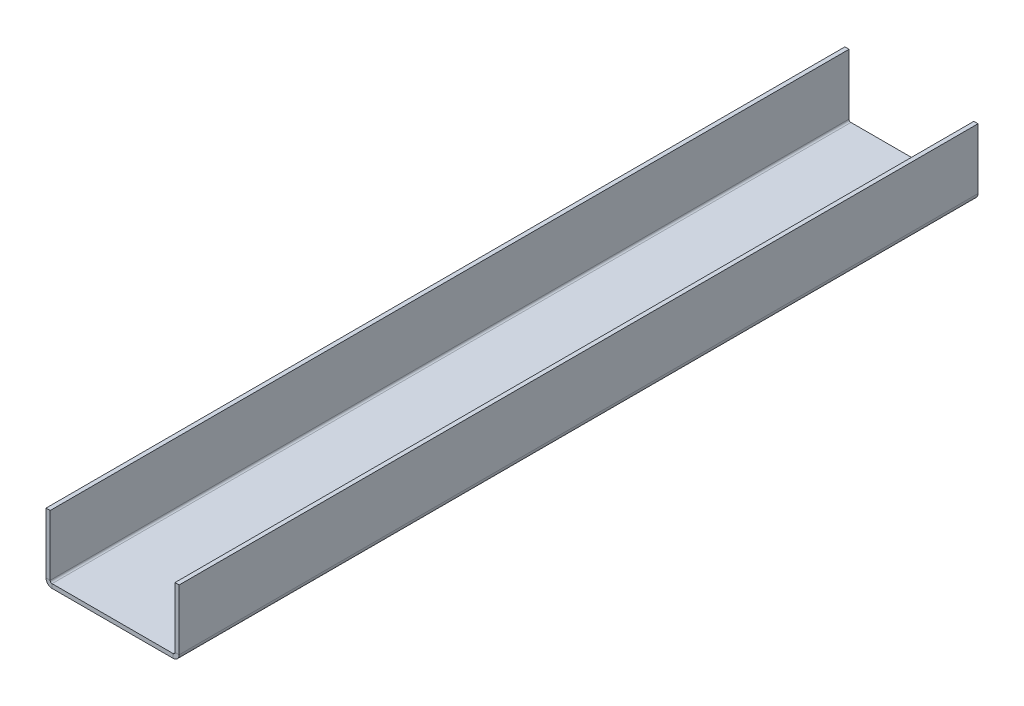
ISO-10303-21;
HEADER;
FILE_DESCRIPTION(('STEP AP214'),'2;1');
FILE_NAME('part.step','',(''),(''),'','','');
FILE_SCHEMA(('AUTOMOTIVE_DESIGN { 1 0 10303 214 1 1 1 1 }'));
ENDSEC;
DATA;
#1=APPLICATION_CONTEXT('core data for automotive mechanical design processes');
#2=APPLICATION_PROTOCOL_DEFINITION('international standard','automotive_design',2000,#1);
#3=PRODUCT_CONTEXT('',#1,'mechanical');
#4=PRODUCT('Part','Part','',(#3));
#5=PRODUCT_RELATED_PRODUCT_CATEGORY('part','',(#4));
#6=PRODUCT_DEFINITION_FORMATION('','',#4);
#7=PRODUCT_DEFINITION_CONTEXT('part definition',#1,'design');
#8=PRODUCT_DEFINITION('design','',#6,#7);
#9=PRODUCT_DEFINITION_SHAPE('','',#8);
#10=(LENGTH_UNIT() NAMED_UNIT(*) SI_UNIT(.MILLI.,.METRE.));
#11=(NAMED_UNIT(*) PLANE_ANGLE_UNIT() SI_UNIT($,.RADIAN.));
#12=(NAMED_UNIT(*) SI_UNIT($,.STERADIAN.) SOLID_ANGLE_UNIT());
#13=UNCERTAINTY_MEASURE_WITH_UNIT(LENGTH_MEASURE(1.E-05),#10,'distance_accuracy_value','');
#14=(GEOMETRIC_REPRESENTATION_CONTEXT(3) GLOBAL_UNCERTAINTY_ASSIGNED_CONTEXT((#13)) GLOBAL_UNIT_ASSIGNED_CONTEXT((#10,
#11,#12)) REPRESENTATION_CONTEXT('',''));
#15=CARTESIAN_POINT('',(0.,0.,0.));
#16=DIRECTION('',(0.,0.,1.));
#17=DIRECTION('',(1.,0.,0.));
#18=AXIS2_PLACEMENT_3D('',#15,#16,#17);
#19=CARTESIAN_POINT('',(0.,-1.5875,0.));
#20=DIRECTION('',(0.,1.,0.));
#21=DIRECTION('',(0.,0.,1.));
#22=AXIS2_PLACEMENT_3D('',#19,#20,#21);
#23=PLANE('',#22);
#24=DIRECTION('',(0.,0.,1.));
#25=VECTOR('',#24,1.);
#26=CARTESIAN_POINT('',(-23.0758999999999,-1.5875,152.4));
#27=LINE('',#26,#25);
#28=CARTESIAN_POINT('',(-23.0758999999999,-1.5875,152.4));
#29=VERTEX_POINT('',#28);
#30=CARTESIAN_POINT('',(-23.0759,-1.5875,-152.4));
#31=VERTEX_POINT('',#30);
#32=EDGE_CURVE('E208',#29,#31,#27,.F.);
#33=ORIENTED_EDGE('',*,*,#32,.T.);
#34=DIRECTION('',(-1.,0.,0.));
#35=VECTOR('',#34,1.);
#36=CARTESIAN_POINT('',(-25.4,-1.5875,-152.4));
#37=LINE('',#36,#35);
#38=CARTESIAN_POINT('',(23.0758999999999,-1.58750000000001,-152.4));
#39=VERTEX_POINT('',#38);
#40=EDGE_CURVE('E13',#39,#31,#37,.T.);
#41=ORIENTED_EDGE('',*,*,#40,.F.);
#42=DIRECTION('',(0.,0.,-1.));
#43=VECTOR('',#42,1.);
#44=CARTESIAN_POINT('',(23.0758999999999,-1.58750000000001,-152.4));
#45=LINE('',#44,#43);
#46=CARTESIAN_POINT('',(23.0759,-1.5875,152.4));
#47=VERTEX_POINT('',#46);
#48=EDGE_CURVE('E261',#39,#47,#45,.F.);
#49=ORIENTED_EDGE('',*,*,#48,.T.);
#50=DIRECTION('',(1.,0.,0.));
#51=VECTOR('',#50,1.);
#52=CARTESIAN_POINT('',(-25.4,-1.5875,152.4));
#53=LINE('',#52,#51);
#54=EDGE_CURVE('E84',#29,#47,#53,.T.);
#55=ORIENTED_EDGE('',*,*,#54,.F.);
#56=EDGE_LOOP('',(#33,#41,#49,#55));
#57=FACE_BOUND('',#56,.T.);
#58=ADVANCED_FACE('F75',(#57),#23,.F.);
#59=CARTESIAN_POINT('',(0.,0.,0.));
#60=DIRECTION('',(0.,1.,0.));
#61=DIRECTION('',(0.,0.,1.));
#62=AXIS2_PLACEMENT_3D('',#59,#60,#61);
#63=PLANE('',#62);
#64=DIRECTION('',(-1.,0.,0.));
#65=VECTOR('',#64,1.);
#66=CARTESIAN_POINT('',(-25.4,0.,-152.4));
#67=LINE('',#66,#65);
#68=CARTESIAN_POINT('',(23.0759,0.,-152.4));
#69=VERTEX_POINT('',#68);
#70=CARTESIAN_POINT('',(-23.0759,0.,-152.4));
#71=VERTEX_POINT('',#70);
#72=EDGE_CURVE('E79',#69,#71,#67,.T.);
#73=ORIENTED_EDGE('',*,*,#72,.T.);
#74=DIRECTION('',(0.,0.,1.));
#75=VECTOR('',#74,1.);
#76=CARTESIAN_POINT('',(-23.0759,0.,152.4));
#77=LINE('',#76,#75);
#78=CARTESIAN_POINT('',(-23.0759,0.,152.4));
#79=VERTEX_POINT('',#78);
#80=EDGE_CURVE('E220',#79,#71,#77,.F.);
#81=ORIENTED_EDGE('',*,*,#80,.F.);
#82=DIRECTION('',(1.,0.,0.));
#83=VECTOR('',#82,1.);
#84=CARTESIAN_POINT('',(-25.4,0.,152.4));
#85=LINE('',#84,#83);
#86=CARTESIAN_POINT('',(23.0759,0.,152.4));
#87=VERTEX_POINT('',#86);
#88=EDGE_CURVE('E279',#79,#87,#85,.T.);
#89=ORIENTED_EDGE('',*,*,#88,.T.);
#90=DIRECTION('',(0.,0.,-1.));
#91=VECTOR('',#90,1.);
#92=CARTESIAN_POINT('',(23.0759,0.,-152.4));
#93=LINE('',#92,#91);
#94=EDGE_CURVE('E92',#69,#87,#93,.F.);
#95=ORIENTED_EDGE('',*,*,#94,.F.);
#96=EDGE_LOOP('',(#73,#81,#89,#95));
#97=FACE_BOUND('',#96,.T.);
#98=ADVANCED_FACE('F283',(#97),#63,.T.);
#99=CARTESIAN_POINT('',(-25.4,-1.5875,152.4));
#100=DIRECTION('',(0.,0.,1.));
#101=DIRECTION('',(1.,0.,0.));
#102=AXIS2_PLACEMENT_3D('',#99,#100,#101);
#103=PLANE('',#102);
#104=ORIENTED_EDGE('',*,*,#88,.F.);
#105=DIRECTION('',(0.,-1.,0.));
#106=VECTOR('',#105,1.);
#107=CARTESIAN_POINT('',(-23.0759,0.,152.4));
#108=LINE('',#107,#106);
#109=EDGE_CURVE('E214',#79,#29,#108,.T.);
#110=ORIENTED_EDGE('',*,*,#109,.T.);
#111=ORIENTED_EDGE('',*,*,#54,.T.);
#112=DIRECTION('',(0.,-1.,0.));
#113=VECTOR('',#112,1.);
#114=CARTESIAN_POINT('',(23.0759,0.,152.4));
#115=LINE('',#114,#113);
#116=EDGE_CURVE('E276',#87,#47,#115,.T.);
#117=ORIENTED_EDGE('',*,*,#116,.F.);
#118=EDGE_LOOP('',(#104,#110,#111,#117));
#119=FACE_BOUND('',#118,.T.);
#120=ADVANCED_FACE('F77',(#119),#103,.T.);
#121=CARTESIAN_POINT('',(-25.4,-1.5875,-152.4));
#122=DIRECTION('',(0.,0.,-1.));
#123=DIRECTION('',(-1.,0.,0.));
#124=AXIS2_PLACEMENT_3D('',#121,#122,#123);
#125=PLANE('',#124);
#126=DIRECTION('',(0.,-1.,0.));
#127=VECTOR('',#126,1.);
#128=CARTESIAN_POINT('',(-23.0759,0.,-152.4));
#129=LINE('',#128,#127);
#130=EDGE_CURVE('E226',#71,#31,#129,.T.);
#131=ORIENTED_EDGE('',*,*,#130,.F.);
#132=ORIENTED_EDGE('',*,*,#72,.F.);
#133=DIRECTION('',(0.,-1.,0.));
#134=VECTOR('',#133,1.);
#135=CARTESIAN_POINT('',(23.0759,0.,-152.4));
#136=LINE('',#135,#134);
#137=EDGE_CURVE('E267',#69,#39,#136,.T.);
#138=ORIENTED_EDGE('',*,*,#137,.T.);
#139=ORIENTED_EDGE('',*,*,#40,.T.);
#140=EDGE_LOOP('',(#131,#132,#138,#139));
#141=FACE_BOUND('',#140,.T.);
#142=ADVANCED_FACE('F357',(#141),#125,.T.);
#143=CARTESIAN_POINT('',(23.0759,0.736600000000003,152.4));
#144=DIRECTION('',(0.,0.,1.));
#145=DIRECTION('',(1.,0.,0.));
#146=AXIS2_PLACEMENT_3D('',#143,#144,#145);
#147=PLANE('',#146);
#148=DIRECTION('',(-1.,0.,0.));
#149=VECTOR('',#148,1.);
#150=CARTESIAN_POINT('',(25.4,0.736599999999991,152.4));
#151=LINE('',#150,#149);
#152=CARTESIAN_POINT('',(23.8125,0.7366,152.4));
#153=VERTEX_POINT('',#152);
#154=CARTESIAN_POINT('',(25.4,0.736599999999995,152.4));
#155=VERTEX_POINT('',#154);
#156=EDGE_CURVE('E229',#153,#155,#151,.F.);
#157=ORIENTED_EDGE('',*,*,#156,.F.);
#158=CARTESIAN_POINT('',(23.0759,0.736600000000003,152.4));
#159=DIRECTION('',(0.,0.,-1.));
#160=DIRECTION('',(-1.,0.,0.));
#161=AXIS2_PLACEMENT_3D('',#158,#159,#160);
#162=CIRCLE('',#161,0.736600000000018);
#163=EDGE_CURVE('E270',#87,#153,#162,.F.);
#164=ORIENTED_EDGE('',*,*,#163,.F.);
#165=ORIENTED_EDGE('',*,*,#116,.T.);
#166=CARTESIAN_POINT('',(23.0759,0.736600000000003,152.4));
#167=DIRECTION('',(0.,0.,-1.));
#168=DIRECTION('',(-1.,0.,0.));
#169=AXIS2_PLACEMENT_3D('',#166,#167,#168);
#170=CIRCLE('',#169,2.32410000000002);
#171=EDGE_CURVE('E263',#47,#155,#170,.F.);
#172=ORIENTED_EDGE('',*,*,#171,.T.);
#173=EDGE_LOOP('',(#157,#164,#165,#172));
#174=FACE_BOUND('',#173,.T.);
#175=ADVANCED_FACE('F314',(#174),#147,.T.);
#176=CARTESIAN_POINT('',(23.0759,0.736600000000003,-152.4));
#177=DIRECTION('',(0.,0.,1.));
#178=DIRECTION('',(1.,0.,0.));
#179=AXIS2_PLACEMENT_3D('',#176,#177,#178);
#180=PLANE('',#179);
#181=CARTESIAN_POINT('',(23.0759,0.736600000000003,-152.4));
#182=DIRECTION('',(0.,0.,-1.));
#183=DIRECTION('',(-1.,0.,0.));
#184=AXIS2_PLACEMENT_3D('',#181,#182,#183);
#185=CIRCLE('',#184,0.736600000000018);
#186=CARTESIAN_POINT('',(23.8125,0.7366,-152.4));
#187=VERTEX_POINT('',#186);
#188=EDGE_CURVE('E234',#187,#69,#185,.T.);
#189=ORIENTED_EDGE('',*,*,#188,.F.);
#190=DIRECTION('',(-1.,0.,0.));
#191=VECTOR('',#190,1.);
#192=CARTESIAN_POINT('',(23.8125,0.736600000000004,-152.4));
#193=LINE('',#192,#191);
#194=CARTESIAN_POINT('',(25.4,0.736599999999998,-152.4));
#195=VERTEX_POINT('',#194);
#196=EDGE_CURVE('E254',#187,#195,#193,.F.);
#197=ORIENTED_EDGE('',*,*,#196,.T.);
#198=CARTESIAN_POINT('',(23.0759,0.736600000000003,-152.4));
#199=DIRECTION('',(0.,0.,-1.));
#200=DIRECTION('',(-1.,0.,0.));
#201=AXIS2_PLACEMENT_3D('',#198,#199,#200);
#202=CIRCLE('',#201,2.32410000000002);
#203=EDGE_CURVE('E264',#195,#39,#202,.T.);
#204=ORIENTED_EDGE('',*,*,#203,.T.);
#205=ORIENTED_EDGE('',*,*,#137,.F.);
#206=EDGE_LOOP('',(#189,#197,#204,#205));
#207=FACE_BOUND('',#206,.T.);
#208=ADVANCED_FACE('F334',(#207),#180,.F.);
#209=CARTESIAN_POINT('',(23.0759,0.736600000000003,-152.4));
#210=DIRECTION('',(0.,0.,-1.));
#211=DIRECTION('',(1.,0.,0.));
#212=AXIS2_PLACEMENT_3D('',#209,#210,#211);
#213=CYLINDRICAL_SURFACE('',#212,2.32410000000002);
#214=ORIENTED_EDGE('',*,*,#48,.F.);
#215=ORIENTED_EDGE('',*,*,#203,.F.);
#216=DIRECTION('',(0.,0.,-1.));
#217=VECTOR('',#216,1.);
#218=CARTESIAN_POINT('',(25.4,0.736599999999991,152.4));
#219=LINE('',#218,#217);
#220=EDGE_CURVE('E252',#195,#155,#219,.F.);
#221=ORIENTED_EDGE('',*,*,#220,.T.);
#222=ORIENTED_EDGE('',*,*,#171,.F.);
#223=EDGE_LOOP('',(#214,#215,#221,#222));
#224=FACE_BOUND('',#223,.T.);
#225=ADVANCED_FACE('F344',(#224),#213,.T.);
#226=CARTESIAN_POINT('',(23.0759,0.736600000000003,-152.4));
#227=DIRECTION('',(0.,0.,-1.));
#228=DIRECTION('',(1.,0.,0.));
#229=AXIS2_PLACEMENT_3D('',#226,#227,#228);
#230=CYLINDRICAL_SURFACE('',#229,0.736600000000018);
#231=ORIENTED_EDGE('',*,*,#94,.T.);
#232=ORIENTED_EDGE('',*,*,#163,.T.);
#233=DIRECTION('',(0.,0.,-1.));
#234=VECTOR('',#233,1.);
#235=CARTESIAN_POINT('',(23.8125,0.736599999999997,152.4));
#236=LINE('',#235,#234);
#237=EDGE_CURVE('E257',#153,#187,#236,.T.);
#238=ORIENTED_EDGE('',*,*,#237,.T.);
#239=ORIENTED_EDGE('',*,*,#188,.T.);
#240=EDGE_LOOP('',(#231,#232,#238,#239));
#241=FACE_BOUND('',#240,.T.);
#242=ADVANCED_FACE('F311',(#241),#230,.F.);
#243=CARTESIAN_POINT('',(25.4000000000001,23.8125,-152.4));
#244=DIRECTION('',(0.,0.,1.));
#245=DIRECTION('',(1.,0.,0.));
#246=AXIS2_PLACEMENT_3D('',#243,#244,#245);
#247=PLANE('',#246);
#248=ORIENTED_EDGE('',*,*,#196,.F.);
#249=DIRECTION('',(0.,-1.,0.));
#250=VECTOR('',#249,1.);
#251=CARTESIAN_POINT('',(23.8125000000001,23.8125,-152.4));
#252=LINE('',#251,#250);
#253=CARTESIAN_POINT('',(23.8125000000001,23.8125,-152.4));
#254=VERTEX_POINT('',#253);
#255=EDGE_CURVE('E250',#187,#254,#252,.F.);
#256=ORIENTED_EDGE('',*,*,#255,.T.);
#257=DIRECTION('',(-1.,0.,0.));
#258=VECTOR('',#257,1.);
#259=CARTESIAN_POINT('',(25.4000000000001,23.8125,-152.4));
#260=LINE('',#259,#258);
#261=CARTESIAN_POINT('',(25.4000000000001,23.8125,-152.4));
#262=VERTEX_POINT('',#261);
#263=EDGE_CURVE('E231',#262,#254,#260,.T.);
#264=ORIENTED_EDGE('',*,*,#263,.F.);
#265=DIRECTION('',(0.,1.,0.));
#266=VECTOR('',#265,1.);
#267=CARTESIAN_POINT('',(25.4,0.,-152.4));
#268=LINE('',#267,#266);
#269=EDGE_CURVE('E243',#195,#262,#268,.T.);
#270=ORIENTED_EDGE('',*,*,#269,.F.);
#271=EDGE_LOOP('',(#248,#256,#264,#270));
#272=FACE_BOUND('',#271,.T.);
#273=ADVANCED_FACE('F336',(#272),#247,.F.);
#274=CARTESIAN_POINT('',(25.4,0.,152.4));
#275=DIRECTION('',(0.,0.,-1.));
#276=DIRECTION('',(-1.,0.,0.));
#277=AXIS2_PLACEMENT_3D('',#274,#275,#276);
#278=PLANE('',#277);
#279=ORIENTED_EDGE('',*,*,#156,.T.);
#280=DIRECTION('',(0.,-1.,0.));
#281=VECTOR('',#280,1.);
#282=CARTESIAN_POINT('',(25.4,0.,152.4));
#283=LINE('',#282,#281);
#284=CARTESIAN_POINT('',(25.4000000000001,23.8125,152.4));
#285=VERTEX_POINT('',#284);
#286=EDGE_CURVE('E238',#285,#155,#283,.T.);
#287=ORIENTED_EDGE('',*,*,#286,.F.);
#288=DIRECTION('',(-1.,0.,0.));
#289=VECTOR('',#288,1.);
#290=CARTESIAN_POINT('',(25.4000000000001,23.8125,152.4));
#291=LINE('',#290,#289);
#292=CARTESIAN_POINT('',(23.8125000000001,23.8125,152.4));
#293=VERTEX_POINT('',#292);
#294=EDGE_CURVE('E235',#285,#293,#291,.T.);
#295=ORIENTED_EDGE('',*,*,#294,.T.);
#296=DIRECTION('',(0.,1.,0.));
#297=VECTOR('',#296,1.);
#298=CARTESIAN_POINT('',(23.8125,0.,152.4));
#299=LINE('',#298,#297);
#300=EDGE_CURVE('E245',#293,#153,#299,.F.);
#301=ORIENTED_EDGE('',*,*,#300,.T.);
#302=EDGE_LOOP('',(#279,#287,#295,#301));
#303=FACE_BOUND('',#302,.T.);
#304=ADVANCED_FACE('F317',(#303),#278,.F.);
#305=CARTESIAN_POINT('',(25.4,0.,0.));
#306=DIRECTION('',(-1.,0.,0.));
#307=DIRECTION('',(0.,-1.,0.));
#308=AXIS2_PLACEMENT_3D('',#305,#306,#307);
#309=PLANE('',#308);
#310=ORIENTED_EDGE('',*,*,#220,.F.);
#311=ORIENTED_EDGE('',*,*,#269,.T.);
#312=DIRECTION('',(0.,0.,1.));
#313=VECTOR('',#312,1.);
#314=CARTESIAN_POINT('',(25.4000000000001,23.8125,0.));
#315=LINE('',#314,#313);
#316=EDGE_CURVE('E241',#262,#285,#315,.T.);
#317=ORIENTED_EDGE('',*,*,#316,.T.);
#318=ORIENTED_EDGE('',*,*,#286,.T.);
#319=EDGE_LOOP('',(#310,#311,#317,#318));
#320=FACE_BOUND('',#319,.T.);
#321=ADVANCED_FACE('F321',(#320),#309,.F.);
#322=CARTESIAN_POINT('',(23.8125,0.,0.));
#323=DIRECTION('',(-1.,0.,0.));
#324=DIRECTION('',(0.,-1.,0.));
#325=AXIS2_PLACEMENT_3D('',#322,#323,#324);
#326=PLANE('',#325);
#327=ORIENTED_EDGE('',*,*,#255,.F.);
#328=ORIENTED_EDGE('',*,*,#237,.F.);
#329=ORIENTED_EDGE('',*,*,#300,.F.);
#330=DIRECTION('',(0.,0.,-1.));
#331=VECTOR('',#330,1.);
#332=CARTESIAN_POINT('',(23.8125000000001,23.8125,152.4));
#333=LINE('',#332,#331);
#334=EDGE_CURVE('E248',#254,#293,#333,.F.);
#335=ORIENTED_EDGE('',*,*,#334,.F.);
#336=EDGE_LOOP('',(#327,#328,#329,#335));
#337=FACE_BOUND('',#336,.T.);
#338=ADVANCED_FACE('F331',(#337),#326,.T.);
#339=CARTESIAN_POINT('',(25.4000000000001,23.8125,152.4));
#340=DIRECTION('',(0.,-1.,0.));
#341=DIRECTION('',(1.,0.,0.));
#342=AXIS2_PLACEMENT_3D('',#339,#340,#341);
#343=PLANE('',#342);
#344=ORIENTED_EDGE('',*,*,#334,.T.);
#345=ORIENTED_EDGE('',*,*,#294,.F.);
#346=ORIENTED_EDGE('',*,*,#316,.F.);
#347=ORIENTED_EDGE('',*,*,#263,.T.);
#348=EDGE_LOOP('',(#344,#345,#346,#347));
#349=FACE_BOUND('',#348,.T.);
#350=ADVANCED_FACE('F327',(#349),#343,.F.);
#351=CARTESIAN_POINT('',(-23.0759,0.736599999999999,-152.4));
#352=DIRECTION('',(0.,0.,-1.));
#353=DIRECTION('',(0.,1.,0.));
#354=AXIS2_PLACEMENT_3D('',#351,#352,#353);
#355=PLANE('',#354);
#356=DIRECTION('',(1.,0.,0.));
#357=VECTOR('',#356,1.);
#358=CARTESIAN_POINT('',(-25.4,0.736599999999991,-152.4));
#359=LINE('',#358,#357);
#360=CARTESIAN_POINT('',(-23.8125,0.736599999999996,-152.4));
#361=VERTEX_POINT('',#360);
#362=CARTESIAN_POINT('',(-25.4,0.73659999999999,-152.4));
#363=VERTEX_POINT('',#362);
#364=EDGE_CURVE('E191',#361,#363,#359,.F.);
#365=ORIENTED_EDGE('',*,*,#364,.F.);
#366=CARTESIAN_POINT('',(-23.0759,0.736599999999999,-152.4));
#367=DIRECTION('',(0.,0.,1.));
#368=DIRECTION('',(0.,-1.,0.));
#369=AXIS2_PLACEMENT_3D('',#366,#367,#368);
#370=CIRCLE('',#369,0.736600000000021);
#371=EDGE_CURVE('E217',#71,#361,#370,.F.);
#372=ORIENTED_EDGE('',*,*,#371,.F.);
#373=ORIENTED_EDGE('',*,*,#130,.T.);
#374=CARTESIAN_POINT('',(-23.0759,0.736599999999999,-152.4));
#375=DIRECTION('',(0.,0.,1.));
#376=DIRECTION('',(0.,-1.,0.));
#377=AXIS2_PLACEMENT_3D('',#374,#375,#376);
#378=CIRCLE('',#377,2.32410000000002);
#379=EDGE_CURVE('E210',#31,#363,#378,.F.);
#380=ORIENTED_EDGE('',*,*,#379,.T.);
#381=EDGE_LOOP('',(#365,#372,#373,#380));
#382=FACE_BOUND('',#381,.T.);
#383=ADVANCED_FACE('F292',(#382),#355,.T.);
#384=CARTESIAN_POINT('',(-23.0759,0.736600000000021,152.4));
#385=DIRECTION('',(0.,0.,-1.));
#386=DIRECTION('',(0.,1.,0.));
#387=AXIS2_PLACEMENT_3D('',#384,#385,#386);
#388=PLANE('',#387);
#389=CARTESIAN_POINT('',(-23.0759,0.736600000000021,152.4));
#390=DIRECTION('',(0.,0.,1.));
#391=DIRECTION('',(0.,-1.,0.));
#392=AXIS2_PLACEMENT_3D('',#389,#390,#391);
#393=CIRCLE('',#392,0.736600000000021);
#394=CARTESIAN_POINT('',(-23.8125,0.736600000000019,152.4));
#395=VERTEX_POINT('',#394);
#396=EDGE_CURVE('E223',#395,#79,#393,.T.);
#397=ORIENTED_EDGE('',*,*,#396,.F.);
#398=DIRECTION('',(1.,0.,0.));
#399=VECTOR('',#398,1.);
#400=CARTESIAN_POINT('',(-23.8125,0.736600000000018,152.4));
#401=LINE('',#400,#399);
#402=CARTESIAN_POINT('',(-25.4,0.736600000000012,152.4));
#403=VERTEX_POINT('',#402);
#404=EDGE_CURVE('E202',#395,#403,#401,.F.);
#405=ORIENTED_EDGE('',*,*,#404,.T.);
#406=CARTESIAN_POINT('',(-23.0759,0.736600000000021,152.4));
#407=DIRECTION('',(0.,0.,1.));
#408=DIRECTION('',(0.,-1.,0.));
#409=AXIS2_PLACEMENT_3D('',#406,#407,#408);
#410=CIRCLE('',#409,2.32410000000002);
#411=EDGE_CURVE('E211',#403,#29,#410,.T.);
#412=ORIENTED_EDGE('',*,*,#411,.T.);
#413=ORIENTED_EDGE('',*,*,#109,.F.);
#414=EDGE_LOOP('',(#397,#405,#412,#413));
#415=FACE_BOUND('',#414,.T.);
#416=ADVANCED_FACE('F306',(#415),#388,.F.);
#417=CARTESIAN_POINT('',(-23.0759,0.736600000000021,152.4));
#418=DIRECTION('',(0.,0.,1.));
#419=DIRECTION('',(-1.,0.,0.));
#420=AXIS2_PLACEMENT_3D('',#417,#418,#419);
#421=CYLINDRICAL_SURFACE('',#420,2.32410000000002);
#422=ORIENTED_EDGE('',*,*,#32,.F.);
#423=ORIENTED_EDGE('',*,*,#411,.F.);
#424=DIRECTION('',(0.,0.,1.));
#425=VECTOR('',#424,1.);
#426=CARTESIAN_POINT('',(-25.4,0.736599999999991,-152.4));
#427=LINE('',#426,#425);
#428=EDGE_CURVE('E200',#403,#363,#427,.F.);
#429=ORIENTED_EDGE('',*,*,#428,.T.);
#430=ORIENTED_EDGE('',*,*,#379,.F.);
#431=EDGE_LOOP('',(#422,#423,#429,#430));
#432=FACE_BOUND('',#431,.T.);
#433=ADVANCED_FACE('F296',(#432),#421,.T.);
#434=CARTESIAN_POINT('',(-23.0759,0.736600000000021,152.4));
#435=DIRECTION('',(0.,0.,1.));
#436=DIRECTION('',(-1.,0.,0.));
#437=AXIS2_PLACEMENT_3D('',#434,#435,#436);
#438=CYLINDRICAL_SURFACE('',#437,0.736600000000021);
#439=ORIENTED_EDGE('',*,*,#80,.T.);
#440=ORIENTED_EDGE('',*,*,#371,.T.);
#441=DIRECTION('',(0.,0.,1.));
#442=VECTOR('',#441,1.);
#443=CARTESIAN_POINT('',(-23.8125,0.736599999999997,-152.4));
#444=LINE('',#443,#442);
#445=EDGE_CURVE('E205',#361,#395,#444,.T.);
#446=ORIENTED_EDGE('',*,*,#445,.T.);
#447=ORIENTED_EDGE('',*,*,#396,.T.);
#448=EDGE_LOOP('',(#439,#440,#446,#447));
#449=FACE_BOUND('',#448,.T.);
#450=ADVANCED_FACE('F288',(#449),#438,.F.);
#451=CARTESIAN_POINT('',(-25.4,0.,-152.4));
#452=DIRECTION('',(0.,0.,1.));
#453=DIRECTION('',(1.,0.,0.));
#454=AXIS2_PLACEMENT_3D('',#451,#452,#453);
#455=PLANE('',#454);
#456=ORIENTED_EDGE('',*,*,#364,.T.);
#457=DIRECTION('',(0.,-1.,0.));
#458=VECTOR('',#457,1.);
#459=CARTESIAN_POINT('',(-25.4,0.,-152.4));
#460=LINE('',#459,#458);
#461=CARTESIAN_POINT('',(-25.4000000000001,23.8125,-152.4));
#462=VERTEX_POINT('',#461);
#463=EDGE_CURVE('E172',#462,#363,#460,.T.);
#464=ORIENTED_EDGE('',*,*,#463,.F.);
#465=DIRECTION('',(1.,0.,0.));
#466=VECTOR('',#465,1.);
#467=CARTESIAN_POINT('',(-25.4000000000001,23.8125,-152.4));
#468=LINE('',#467,#466);
#469=CARTESIAN_POINT('',(-23.8125000000001,23.8125,-152.4));
#470=VERTEX_POINT('',#469);
#471=EDGE_CURVE('E178',#462,#470,#468,.T.);
#472=ORIENTED_EDGE('',*,*,#471,.T.);
#473=DIRECTION('',(0.,1.,0.));
#474=VECTOR('',#473,1.);
#475=CARTESIAN_POINT('',(-23.8125,0.,-152.4));
#476=LINE('',#475,#474);
#477=EDGE_CURVE('E198',#470,#361,#476,.F.);
#478=ORIENTED_EDGE('',*,*,#477,.T.);
#479=EDGE_LOOP('',(#456,#464,#472,#478));
#480=FACE_BOUND('',#479,.T.);
#481=ADVANCED_FACE('F190',(#480),#455,.F.);
#482=CARTESIAN_POINT('',(-25.4000000000001,23.8125,152.4));
#483=DIRECTION('',(0.,0.,-1.));
#484=DIRECTION('',(-1.,0.,0.));
#485=AXIS2_PLACEMENT_3D('',#482,#483,#484);
#486=PLANE('',#485);
#487=ORIENTED_EDGE('',*,*,#404,.F.);
#488=DIRECTION('',(0.,-1.,0.));
#489=VECTOR('',#488,1.);
#490=CARTESIAN_POINT('',(-23.8125000000001,23.8125,152.4));
#491=LINE('',#490,#489);
#492=CARTESIAN_POINT('',(-23.8125000000001,23.8125,152.4));
#493=VERTEX_POINT('',#492);
#494=EDGE_CURVE('E194',#395,#493,#491,.F.);
#495=ORIENTED_EDGE('',*,*,#494,.T.);
#496=DIRECTION('',(1.,0.,0.));
#497=VECTOR('',#496,1.);
#498=CARTESIAN_POINT('',(-25.4000000000001,23.8125,152.4));
#499=LINE('',#498,#497);
#500=CARTESIAN_POINT('',(-25.4000000000001,23.8125,152.4));
#501=VERTEX_POINT('',#500);
#502=EDGE_CURVE('E187',#501,#493,#499,.T.);
#503=ORIENTED_EDGE('',*,*,#502,.F.);
#504=DIRECTION('',(0.,1.,0.));
#505=VECTOR('',#504,1.);
#506=CARTESIAN_POINT('',(-25.4,0.,152.4));
#507=LINE('',#506,#505);
#508=EDGE_CURVE('E174',#403,#501,#507,.T.);
#509=ORIENTED_EDGE('',*,*,#508,.F.);
#510=EDGE_LOOP('',(#487,#495,#503,#509));
#511=FACE_BOUND('',#510,.T.);
#512=ADVANCED_FACE('F299',(#511),#486,.F.);
#513=CARTESIAN_POINT('',(-25.4,0.,0.));
#514=DIRECTION('',(1.,0.,0.));
#515=DIRECTION('',(0.,1.,0.));
#516=AXIS2_PLACEMENT_3D('',#513,#514,#515);
#517=PLANE('',#516);
#518=ORIENTED_EDGE('',*,*,#428,.F.);
#519=ORIENTED_EDGE('',*,*,#508,.T.);
#520=DIRECTION('',(0.,0.,-1.));
#521=VECTOR('',#520,1.);
#522=CARTESIAN_POINT('',(-25.4000000000001,23.8125,0.));
#523=LINE('',#522,#521);
#524=EDGE_CURVE('E167',#501,#462,#523,.T.);
#525=ORIENTED_EDGE('',*,*,#524,.T.);
#526=ORIENTED_EDGE('',*,*,#463,.T.);
#527=EDGE_LOOP('',(#518,#519,#525,#526));
#528=FACE_BOUND('',#527,.T.);
#529=ADVANCED_FACE('F170',(#528),#517,.F.);
#530=CARTESIAN_POINT('',(-23.8125,0.,0.));
#531=DIRECTION('',(1.,0.,0.));
#532=DIRECTION('',(0.,1.,0.));
#533=AXIS2_PLACEMENT_3D('',#530,#531,#532);
#534=PLANE('',#533);
#535=ORIENTED_EDGE('',*,*,#494,.F.);
#536=ORIENTED_EDGE('',*,*,#445,.F.);
#537=ORIENTED_EDGE('',*,*,#477,.F.);
#538=DIRECTION('',(0.,0.,1.));
#539=VECTOR('',#538,1.);
#540=CARTESIAN_POINT('',(-23.8125000000001,23.8125,-152.4));
#541=LINE('',#540,#539);
#542=EDGE_CURVE('E183',#493,#470,#541,.F.);
#543=ORIENTED_EDGE('',*,*,#542,.F.);
#544=EDGE_LOOP('',(#535,#536,#537,#543));
#545=FACE_BOUND('',#544,.T.);
#546=ADVANCED_FACE('F303',(#545),#534,.T.);
#547=CARTESIAN_POINT('',(-25.4000000000001,23.8125,-152.4));
#548=DIRECTION('',(0.,-1.,0.));
#549=DIRECTION('',(1.,0.,0.));
#550=AXIS2_PLACEMENT_3D('',#547,#548,#549);
#551=PLANE('',#550);
#552=ORIENTED_EDGE('',*,*,#542,.T.);
#553=ORIENTED_EDGE('',*,*,#471,.F.);
#554=ORIENTED_EDGE('',*,*,#524,.F.);
#555=ORIENTED_EDGE('',*,*,#502,.T.);
#556=EDGE_LOOP('',(#552,#553,#554,#555));
#557=FACE_BOUND('',#556,.T.);
#558=ADVANCED_FACE('F181',(#557),#551,.F.);
#559=CLOSED_SHELL('',(#58,#98,#120,#142,#175,#208,#225,#242,#273,#304,#321,#338,#350,#383,#416,
#433,#450,#481,#512,#529,#546,#558));
#560=MANIFOLD_SOLID_BREP('B2',#559);
#561=ADVANCED_BREP_SHAPE_REPRESENTATION('',(#18,#560),#14);
#562=SHAPE_DEFINITION_REPRESENTATION(#9,#561);
ENDSEC;
END-ISO-10303-21;
